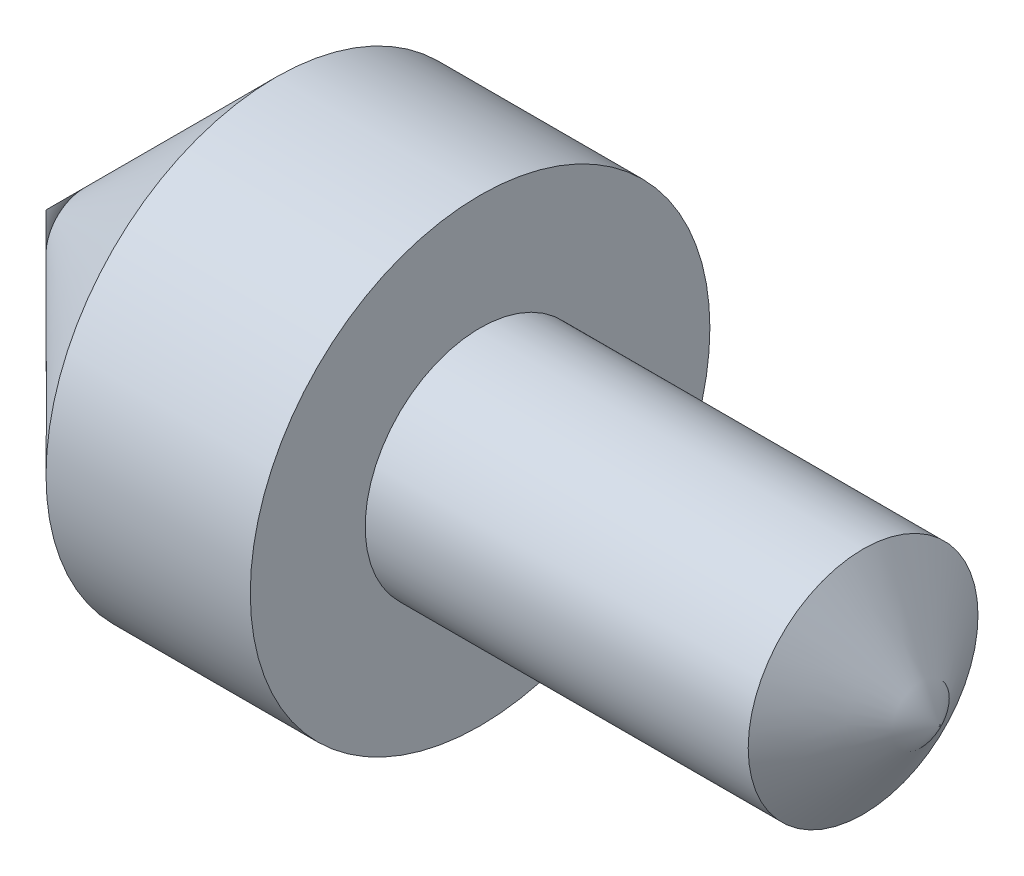
ISO-10303-21;
HEADER;
FILE_DESCRIPTION(('STEP AP214'),'2;1');
FILE_NAME('part.step','',(''),(''),'','','');
FILE_SCHEMA(('AUTOMOTIVE_DESIGN { 1 0 10303 214 1 1 1 1 }'));
ENDSEC;
DATA;
#1=APPLICATION_CONTEXT('core data for automotive mechanical design processes');
#2=APPLICATION_PROTOCOL_DEFINITION('international standard','automotive_design',2000,#1);
#3=PRODUCT_CONTEXT('',#1,'mechanical');
#4=PRODUCT('Part','Part','',(#3));
#5=PRODUCT_RELATED_PRODUCT_CATEGORY('part','',(#4));
#6=PRODUCT_DEFINITION_FORMATION('','',#4);
#7=PRODUCT_DEFINITION_CONTEXT('part definition',#1,'design');
#8=PRODUCT_DEFINITION('design','',#6,#7);
#9=PRODUCT_DEFINITION_SHAPE('','',#8);
#10=(LENGTH_UNIT() NAMED_UNIT(*) SI_UNIT(.MILLI.,.METRE.));
#11=(NAMED_UNIT(*) PLANE_ANGLE_UNIT() SI_UNIT($,.RADIAN.));
#12=(NAMED_UNIT(*) SI_UNIT($,.STERADIAN.) SOLID_ANGLE_UNIT());
#13=UNCERTAINTY_MEASURE_WITH_UNIT(LENGTH_MEASURE(1.E-05),#10,'distance_accuracy_value','');
#14=(GEOMETRIC_REPRESENTATION_CONTEXT(3) GLOBAL_UNCERTAINTY_ASSIGNED_CONTEXT((#13)) GLOBAL_UNIT_ASSIGNED_CONTEXT((#10,
#11,#12)) REPRESENTATION_CONTEXT('',''));
#15=CARTESIAN_POINT('',(0.,0.,0.));
#16=DIRECTION('',(0.,0.,1.));
#17=DIRECTION('',(1.,0.,0.));
#18=AXIS2_PLACEMENT_3D('',#15,#16,#17);
#19=CARTESIAN_POINT('',(-35.,0.,0.));
#20=DIRECTION('',(1.,0.,0.));
#21=DIRECTION('',(0.,0.,-1.));
#22=AXIS2_PLACEMENT_3D('',#19,#20,#21);
#23=CONICAL_SURFACE('',#22,0.,0.78539816339745);
#24=CARTESIAN_POINT('',(-26.,0.,0.));
#25=DIRECTION('',(1.,0.,0.));
#26=DIRECTION('',(0.,0.,-1.));
#27=AXIS2_PLACEMENT_3D('',#24,#25,#26);
#28=CIRCLE('',#27,9.00000000000001);
#29=CARTESIAN_POINT('',(-26.,0.,-9.00000000000001));
#30=VERTEX_POINT('',#29);
#31=EDGE_CURVE('E13',#30,#30,#28,.T.);
#32=ORIENTED_EDGE('',*,*,#31,.F.);
#33=EDGE_LOOP('',(#32));
#34=FACE_BOUND('',#33,.T.);
#35=CARTESIAN_POINT('',(-35.,0.,0.));
#36=VERTEX_POINT('',#35);
#37=VERTEX_LOOP('',#36);
#38=FACE_BOUND('',#37,.T.);
#39=ADVANCED_FACE('F44',(#34,#38),#23,.T.);
#40=CARTESIAN_POINT('',(0.,0.,0.));
#41=DIRECTION('',(1.,0.,0.));
#42=DIRECTION('',(0.,0.,-1.));
#43=AXIS2_PLACEMENT_3D('',#40,#41,#42);
#44=CYLINDRICAL_SURFACE('',#43,9.00000000000001);
#45=CARTESIAN_POINT('',(-18.,0.,0.));
#46=DIRECTION('',(1.,0.,0.));
#47=DIRECTION('',(0.,0.,-1.));
#48=AXIS2_PLACEMENT_3D('',#45,#46,#47);
#49=CIRCLE('',#48,9.00000000000001);
#50=CARTESIAN_POINT('',(-18.,0.,-9.00000000000001));
#51=VERTEX_POINT('',#50);
#52=EDGE_CURVE('E51',#51,#51,#49,.T.);
#53=ORIENTED_EDGE('',*,*,#52,.F.);
#54=EDGE_LOOP('',(#53));
#55=FACE_BOUND('',#54,.T.);
#56=ORIENTED_EDGE('',*,*,#31,.T.);
#57=EDGE_LOOP('',(#56));
#58=FACE_BOUND('',#57,.T.);
#59=ADVANCED_FACE('F58',(#55,#58),#44,.T.);
#60=CARTESIAN_POINT('',(-18.,-4.50000000000001,0.));
#61=DIRECTION('',(-1.,0.,0.));
#62=DIRECTION('',(0.,0.,1.));
#63=AXIS2_PLACEMENT_3D('',#60,#61,#62);
#64=PLANE('',#63);
#65=CARTESIAN_POINT('',(-18.,0.,0.));
#66=DIRECTION('',(1.,0.,0.));
#67=DIRECTION('',(0.,0.,-1.));
#68=AXIS2_PLACEMENT_3D('',#65,#66,#67);
#69=CIRCLE('',#68,4.50000000000001);
#70=CARTESIAN_POINT('',(-18.,0.,-4.50000000000001));
#71=VERTEX_POINT('',#70);
#72=EDGE_CURVE('E86',#71,#71,#69,.T.);
#73=ORIENTED_EDGE('',*,*,#72,.F.);
#74=EDGE_LOOP('',(#73));
#75=FACE_BOUND('',#74,.T.);
#76=ORIENTED_EDGE('',*,*,#52,.T.);
#77=EDGE_LOOP('',(#76));
#78=FACE_BOUND('',#77,.T.);
#79=ADVANCED_FACE('F63',(#75,#78),#64,.F.);
#80=CARTESIAN_POINT('',(0.,0.,0.));
#81=DIRECTION('',(1.,0.,0.));
#82=DIRECTION('',(0.,0.,-1.));
#83=AXIS2_PLACEMENT_3D('',#80,#81,#82);
#84=CYLINDRICAL_SURFACE('',#83,4.5);
#85=CARTESIAN_POINT('',(-3.,0.,0.));
#86=DIRECTION('',(1.,0.,0.));
#87=DIRECTION('',(0.,0.,-1.));
#88=AXIS2_PLACEMENT_3D('',#85,#86,#87);
#89=CIRCLE('',#88,4.5);
#90=CARTESIAN_POINT('',(-3.,0.,-4.5));
#91=VERTEX_POINT('',#90);
#92=EDGE_CURVE('E85',#91,#91,#89,.T.);
#93=ORIENTED_EDGE('',*,*,#92,.F.);
#94=EDGE_LOOP('',(#93));
#95=FACE_BOUND('',#94,.T.);
#96=ORIENTED_EDGE('',*,*,#72,.T.);
#97=EDGE_LOOP('',(#96));
#98=FACE_BOUND('',#97,.T.);
#99=ADVANCED_FACE('F70',(#95,#98),#84,.T.);
#100=CARTESIAN_POINT('',(-3.,0.,0.));
#101=DIRECTION('',(-1.,0.,0.));
#102=DIRECTION('',(0.,0.,1.));
#103=AXIS2_PLACEMENT_3D('',#100,#101,#102);
#104=CONICAL_SURFACE('',#103,4.5,0.982793723247329);
#105=CARTESIAN_POINT('',(0.,0.,0.));
#106=VERTEX_POINT('',#105);
#107=VERTEX_LOOP('',#106);
#108=FACE_BOUND('',#107,.T.);
#109=ORIENTED_EDGE('',*,*,#92,.T.);
#110=EDGE_LOOP('',(#109));
#111=FACE_BOUND('',#110,.T.);
#112=ADVANCED_FACE('F77',(#108,#111),#104,.T.);
#113=CLOSED_SHELL('',(#39,#59,#79,#99,#112));
#114=MANIFOLD_SOLID_BREP('B2',#113);
#115=ADVANCED_BREP_SHAPE_REPRESENTATION('',(#18,#114),#14);
#116=SHAPE_DEFINITION_REPRESENTATION(#9,#115);
ENDSEC;
END-ISO-10303-21;
